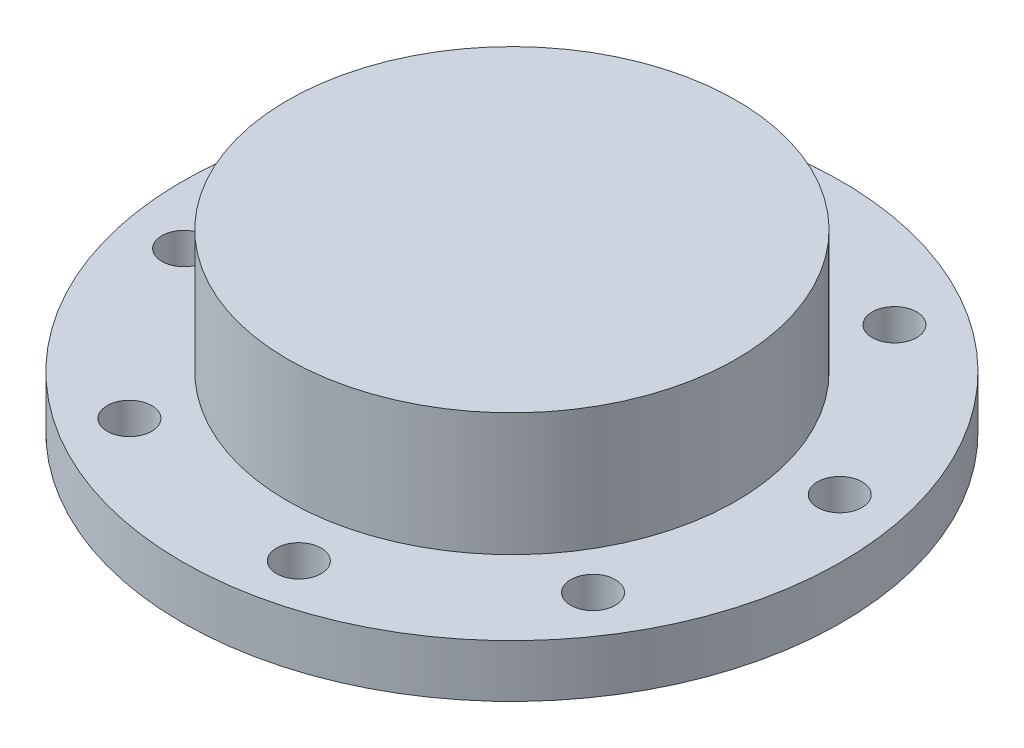
ISO-10303-21;
HEADER;
FILE_DESCRIPTION(('STEP AP214'),'2;1');
FILE_NAME('part.step','',(''),(''),'','','');
FILE_SCHEMA(('AUTOMOTIVE_DESIGN { 1 0 10303 214 1 1 1 1 }'));
ENDSEC;
DATA;
#1=APPLICATION_CONTEXT('core data for automotive mechanical design processes');
#2=APPLICATION_PROTOCOL_DEFINITION('international standard','automotive_design',2000,#1);
#3=PRODUCT_CONTEXT('',#1,'mechanical');
#4=PRODUCT('Part','Part','',(#3));
#5=PRODUCT_RELATED_PRODUCT_CATEGORY('part','',(#4));
#6=PRODUCT_DEFINITION_FORMATION('','',#4);
#7=PRODUCT_DEFINITION_CONTEXT('part definition',#1,'design');
#8=PRODUCT_DEFINITION('design','',#6,#7);
#9=PRODUCT_DEFINITION_SHAPE('','',#8);
#10=(LENGTH_UNIT() NAMED_UNIT(*) SI_UNIT(.MILLI.,.METRE.));
#11=(NAMED_UNIT(*) PLANE_ANGLE_UNIT() SI_UNIT($,.RADIAN.));
#12=(NAMED_UNIT(*) SI_UNIT($,.STERADIAN.) SOLID_ANGLE_UNIT());
#13=UNCERTAINTY_MEASURE_WITH_UNIT(LENGTH_MEASURE(1.E-05),#10,'distance_accuracy_value','');
#14=(GEOMETRIC_REPRESENTATION_CONTEXT(3) GLOBAL_UNCERTAINTY_ASSIGNED_CONTEXT((#13)) GLOBAL_UNIT_ASSIGNED_CONTEXT((#10,
#11,#12)) REPRESENTATION_CONTEXT('',''));
#15=CARTESIAN_POINT('',(0.,0.,0.));
#16=DIRECTION('',(0.,0.,1.));
#17=DIRECTION('',(1.,0.,0.));
#18=AXIS2_PLACEMENT_3D('',#15,#16,#17);
#19=CARTESIAN_POINT('',(0.,-212.944683547694,0.));
#20=DIRECTION('',(0.,1.,0.));
#21=DIRECTION('',(0.,0.,1.));
#22=AXIS2_PLACEMENT_3D('',#19,#20,#21);
#23=PLANE('',#22);
#24=CARTESIAN_POINT('',(-0.00553212594952037,-212.944683547694,0.));
#25=DIRECTION('',(0.,1.,0.));
#26=DIRECTION('',(0.,0.,1.));
#27=AXIS2_PLACEMENT_3D('',#24,#25,#26);
#28=CIRCLE('',#27,63.8870597874158);
#29=CARTESIAN_POINT('',(-0.00553212594952037,-212.944683547694,63.8870597874158));
#30=VERTEX_POINT('',#29);
#31=EDGE_CURVE('E40',#30,#30,#28,.T.);
#32=ORIENTED_EDGE('',*,*,#31,.T.);
#33=EDGE_LOOP('',(#32));
#34=FACE_BOUND('',#33,.T.);
#35=ADVANCED_FACE('F36',(#34),#23,.T.);
#36=CARTESIAN_POINT('',(-0.00553212594954357,165.815985113531,0.));
#37=DIRECTION('',(0.,1.,0.));
#38=DIRECTION('',(-1.,0.,0.));
#39=AXIS2_PLACEMENT_3D('',#36,#37,#38);
#40=CYLINDRICAL_SURFACE('',#39,63.8870597874158);
#41=CARTESIAN_POINT('',(-0.00553212594951823,-247.944683547694,0.));
#42=DIRECTION('',(0.,1.,0.));
#43=DIRECTION('',(0.,0.,1.));
#44=AXIS2_PLACEMENT_3D('',#41,#42,#43);
#45=CIRCLE('',#44,63.8870597874158);
#46=CARTESIAN_POINT('',(-0.00553212594951823,-247.944683547694,63.8870597874158));
#47=VERTEX_POINT('',#46);
#48=EDGE_CURVE('E10',#47,#47,#45,.T.);
#49=ORIENTED_EDGE('',*,*,#48,.T.);
#50=EDGE_LOOP('',(#49));
#51=FACE_BOUND('',#50,.T.);
#52=ORIENTED_EDGE('',*,*,#31,.F.);
#53=EDGE_LOOP('',(#52));
#54=FACE_BOUND('',#53,.T.);
#55=ADVANCED_FACE('F38',(#51,#54),#40,.T.);
#56=CARTESIAN_POINT('',(0.,-262.944683547694,0.));
#57=DIRECTION('',(0.,1.,0.));
#58=DIRECTION('',(0.,0.,1.));
#59=AXIS2_PLACEMENT_3D('',#56,#57,#58);
#60=PLANE('',#59);
#61=CARTESIAN_POINT('',(0.,-262.944683547694,0.));
#62=DIRECTION('',(0.,-1.,0.));
#63=DIRECTION('',(0.,0.,-1.));
#64=AXIS2_PLACEMENT_3D('',#61,#62,#63);
#65=CIRCLE('',#64,56.895);
#66=CARTESIAN_POINT('',(0.,-262.944683547694,-56.895));
#67=VERTEX_POINT('',#66);
#68=EDGE_CURVE('E120',#67,#67,#65,.T.);
#69=ORIENTED_EDGE('',*,*,#68,.F.);
#70=EDGE_LOOP('',(#69));
#71=FACE_BOUND('',#70,.T.);
#72=CARTESIAN_POINT('',(-77.0486836093335,-262.944683547694,16.3377712930384));
#73=DIRECTION('',(0.,-1.,0.));
#74=DIRECTION('',(0.,0.,-1.));
#75=AXIS2_PLACEMENT_3D('',#72,#73,#74);
#76=CIRCLE('',#75,6.34999999999999);
#77=CARTESIAN_POINT('',(-77.0486836093335,-262.944683547694,9.98777129303844));
#78=VERTEX_POINT('',#77);
#79=EDGE_CURVE('E116',#78,#78,#76,.T.);
#80=ORIENTED_EDGE('',*,*,#79,.F.);
#81=EDGE_LOOP('',(#80));
#82=FACE_BOUND('',#81,.T.);
#83=CARTESIAN_POINT('',(-16.3377712930382,-262.944683547694,-77.0486836093336));
#84=DIRECTION('',(0.,-1.,0.));
#85=DIRECTION('',(0.,0.,-1.));
#86=AXIS2_PLACEMENT_3D('',#83,#84,#85);
#87=CIRCLE('',#86,6.35);
#88=CARTESIAN_POINT('',(-16.3377712930382,-262.944683547694,-83.3986836093336));
#89=VERTEX_POINT('',#88);
#90=EDGE_CURVE('E100',#89,#89,#87,.T.);
#91=ORIENTED_EDGE('',*,*,#90,.F.);
#92=EDGE_LOOP('',(#91));
#93=FACE_BOUND('',#92,.T.);
#94=CARTESIAN_POINT('',(77.0486836093336,-262.944683547694,-16.3377712930379));
#95=DIRECTION('',(0.,-1.,0.));
#96=DIRECTION('',(0.,0.,-1.));
#97=AXIS2_PLACEMENT_3D('',#94,#95,#96);
#98=CIRCLE('',#97,6.34999999999999);
#99=CARTESIAN_POINT('',(77.0486836093336,-262.944683547694,-22.6877712930379));
#100=VERTEX_POINT('',#99);
#101=EDGE_CURVE('E84',#100,#100,#98,.T.);
#102=ORIENTED_EDGE('',*,*,#101,.F.);
#103=EDGE_LOOP('',(#102));
#104=FACE_BOUND('',#103,.T.);
#105=CARTESIAN_POINT('',(16.3377712930376,-262.944683547694,77.0486836093337));
#106=DIRECTION('',(0.,-1.,0.));
#107=DIRECTION('',(0.,0.,-1.));
#108=AXIS2_PLACEMENT_3D('',#105,#106,#107);
#109=CIRCLE('',#108,6.35);
#110=CARTESIAN_POINT('',(16.3377712930376,-262.944683547694,70.6986836093337));
#111=VERTEX_POINT('',#110);
#112=EDGE_CURVE('E68',#111,#111,#109,.T.);
#113=ORIENTED_EDGE('',*,*,#112,.F.);
#114=EDGE_LOOP('',(#113));
#115=FACE_BOUND('',#114,.T.);
#116=CARTESIAN_POINT('',(-42.9290977908749,-262.944683547694,66.0341955324384));
#117=DIRECTION('',(0.,-1.,0.));
#118=DIRECTION('',(0.,0.,-1.));
#119=AXIS2_PLACEMENT_3D('',#116,#117,#118);
#120=CIRCLE('',#119,6.35);
#121=CARTESIAN_POINT('',(-42.9290977908749,-262.944683547694,59.6841955324384));
#122=VERTEX_POINT('',#121);
#123=EDGE_CURVE('E60',#122,#122,#120,.T.);
#124=ORIENTED_EDGE('',*,*,#123,.F.);
#125=EDGE_LOOP('',(#124));
#126=FACE_BOUND('',#125,.T.);
#127=CARTESIAN_POINT('',(0.,-262.944683547694,0.));
#128=DIRECTION('',(0.,1.,0.));
#129=DIRECTION('',(0.,0.,1.));
#130=AXIS2_PLACEMENT_3D('',#127,#128,#129);
#131=CIRCLE('',#130,93.8815276614418);
#132=CARTESIAN_POINT('',(0.,-262.944683547694,93.8815276614418));
#133=VERTEX_POINT('',#132);
#134=EDGE_CURVE('E50',#133,#133,#131,.T.);
#135=ORIENTED_EDGE('',*,*,#134,.F.);
#136=EDGE_LOOP('',(#135));
#137=FACE_BOUND('',#136,.T.);
#138=CARTESIAN_POINT('',(66.0341955324385,-262.944683547694,42.9290977908747));
#139=DIRECTION('',(0.,-1.,0.));
#140=DIRECTION('',(0.,0.,-1.));
#141=AXIS2_PLACEMENT_3D('',#138,#139,#140);
#142=CIRCLE('',#141,6.34999999999999);
#143=CARTESIAN_POINT('',(66.0341955324385,-262.944683547694,36.5790977908747));
#144=VERTEX_POINT('',#143);
#145=EDGE_CURVE('E76',#144,#144,#142,.T.);
#146=ORIENTED_EDGE('',*,*,#145,.F.);
#147=EDGE_LOOP('',(#146));
#148=FACE_BOUND('',#147,.T.);
#149=CARTESIAN_POINT('',(42.9290977908749,-262.944683547694,-66.0341955324384));
#150=DIRECTION('',(0.,-1.,0.));
#151=DIRECTION('',(0.,0.,-1.));
#152=AXIS2_PLACEMENT_3D('',#149,#150,#151);
#153=CIRCLE('',#152,6.35);
#154=CARTESIAN_POINT('',(42.9290977908749,-262.944683547694,-72.3841955324384));
#155=VERTEX_POINT('',#154);
#156=EDGE_CURVE('E92',#155,#155,#153,.T.);
#157=ORIENTED_EDGE('',*,*,#156,.F.);
#158=EDGE_LOOP('',(#157));
#159=FACE_BOUND('',#158,.T.);
#160=CARTESIAN_POINT('',(-66.0341955324388,-262.944683547694,-42.9290977908743));
#161=DIRECTION('',(0.,-1.,0.));
#162=DIRECTION('',(0.,0.,-1.));
#163=AXIS2_PLACEMENT_3D('',#160,#161,#162);
#164=CIRCLE('',#163,6.35);
#165=CARTESIAN_POINT('',(-66.0341955324388,-262.944683547694,-49.2790977908743));
#166=VERTEX_POINT('',#165);
#167=EDGE_CURVE('E108',#166,#166,#164,.T.);
#168=ORIENTED_EDGE('',*,*,#167,.F.);
#169=EDGE_LOOP('',(#168));
#170=FACE_BOUND('',#169,.T.);
#171=ADVANCED_FACE('F153',(#71,#82,#93,#104,#115,#126,#137,#148,#159,#170),#60,.F.);
#172=CARTESIAN_POINT('',(0.,-247.944683547694,0.));
#173=DIRECTION('',(0.,1.,0.));
#174=DIRECTION('',(0.,0.,1.));
#175=AXIS2_PLACEMENT_3D('',#172,#173,#174);
#176=PLANE('',#175);
#177=CARTESIAN_POINT('',(-77.0486836093335,-247.944683547694,16.3377712930384));
#178=DIRECTION('',(0.,1.,0.));
#179=DIRECTION('',(0.,0.,1.));
#180=AXIS2_PLACEMENT_3D('',#177,#178,#179);
#181=CIRCLE('',#180,6.34999999999998);
#182=CARTESIAN_POINT('',(-77.0486836093335,-247.944683547694,22.6877712930384));
#183=VERTEX_POINT('',#182);
#184=EDGE_CURVE('E112',#183,#183,#181,.T.);
#185=ORIENTED_EDGE('',*,*,#184,.F.);
#186=EDGE_LOOP('',(#185));
#187=FACE_BOUND('',#186,.T.);
#188=CARTESIAN_POINT('',(-66.0341955324388,-247.944683547694,-42.9290977908743));
#189=DIRECTION('',(0.,1.,0.));
#190=DIRECTION('',(0.,0.,1.));
#191=AXIS2_PLACEMENT_3D('',#188,#189,#190);
#192=CIRCLE('',#191,6.34999999999999);
#193=CARTESIAN_POINT('',(-66.0341955324388,-247.944683547694,-36.5790977908743));
#194=VERTEX_POINT('',#193);
#195=EDGE_CURVE('E104',#194,#194,#192,.T.);
#196=ORIENTED_EDGE('',*,*,#195,.F.);
#197=EDGE_LOOP('',(#196));
#198=FACE_BOUND('',#197,.T.);
#199=CARTESIAN_POINT('',(-16.3377712930382,-247.944683547694,-77.0486836093336));
#200=DIRECTION('',(0.,1.,0.));
#201=DIRECTION('',(0.,0.,1.));
#202=AXIS2_PLACEMENT_3D('',#199,#200,#201);
#203=CIRCLE('',#202,6.34999999999999);
#204=CARTESIAN_POINT('',(-16.3377712930382,-247.944683547694,-70.6986836093336));
#205=VERTEX_POINT('',#204);
#206=EDGE_CURVE('E96',#205,#205,#203,.T.);
#207=ORIENTED_EDGE('',*,*,#206,.F.);
#208=EDGE_LOOP('',(#207));
#209=FACE_BOUND('',#208,.T.);
#210=CARTESIAN_POINT('',(42.9290977908749,-247.944683547694,-66.0341955324384));
#211=DIRECTION('',(0.,1.,0.));
#212=DIRECTION('',(0.,0.,1.));
#213=AXIS2_PLACEMENT_3D('',#210,#211,#212);
#214=CIRCLE('',#213,6.34999999999999);
#215=CARTESIAN_POINT('',(42.9290977908749,-247.944683547694,-59.6841955324384));
#216=VERTEX_POINT('',#215);
#217=EDGE_CURVE('E88',#216,#216,#214,.T.);
#218=ORIENTED_EDGE('',*,*,#217,.F.);
#219=EDGE_LOOP('',(#218));
#220=FACE_BOUND('',#219,.T.);
#221=CARTESIAN_POINT('',(77.0486836093336,-247.944683547694,-16.3377712930379));
#222=DIRECTION('',(0.,1.,0.));
#223=DIRECTION('',(0.,0.,1.));
#224=AXIS2_PLACEMENT_3D('',#221,#222,#223);
#225=CIRCLE('',#224,6.34999999999998);
#226=CARTESIAN_POINT('',(77.0486836093336,-247.944683547694,-9.98777129303792));
#227=VERTEX_POINT('',#226);
#228=EDGE_CURVE('E80',#227,#227,#225,.T.);
#229=ORIENTED_EDGE('',*,*,#228,.F.);
#230=EDGE_LOOP('',(#229));
#231=FACE_BOUND('',#230,.T.);
#232=CARTESIAN_POINT('',(66.0341955324385,-247.944683547694,42.9290977908747));
#233=DIRECTION('',(0.,1.,0.));
#234=DIRECTION('',(0.,0.,1.));
#235=AXIS2_PLACEMENT_3D('',#232,#233,#234);
#236=CIRCLE('',#235,6.34999999999998);
#237=CARTESIAN_POINT('',(66.0341955324385,-247.944683547694,49.2790977908747));
#238=VERTEX_POINT('',#237);
#239=EDGE_CURVE('E72',#238,#238,#236,.T.);
#240=ORIENTED_EDGE('',*,*,#239,.F.);
#241=EDGE_LOOP('',(#240));
#242=FACE_BOUND('',#241,.T.);
#243=CARTESIAN_POINT('',(16.3377712930376,-247.944683547694,77.0486836093337));
#244=DIRECTION('',(0.,1.,0.));
#245=DIRECTION('',(0.,0.,1.));
#246=AXIS2_PLACEMENT_3D('',#243,#244,#245);
#247=CIRCLE('',#246,6.34999999999999);
#248=CARTESIAN_POINT('',(16.3377712930376,-247.944683547694,83.3986836093337));
#249=VERTEX_POINT('',#248);
#250=EDGE_CURVE('E64',#249,#249,#247,.T.);
#251=ORIENTED_EDGE('',*,*,#250,.F.);
#252=EDGE_LOOP('',(#251));
#253=FACE_BOUND('',#252,.T.);
#254=CARTESIAN_POINT('',(-42.9290977908749,-247.944683547694,66.0341955324384));
#255=DIRECTION('',(0.,1.,0.));
#256=DIRECTION('',(0.,0.,1.));
#257=AXIS2_PLACEMENT_3D('',#254,#255,#256);
#258=CIRCLE('',#257,6.34999999999999);
#259=CARTESIAN_POINT('',(-42.9290977908749,-247.944683547694,72.3841955324384));
#260=VERTEX_POINT('',#259);
#261=EDGE_CURVE('E55',#260,#260,#258,.T.);
#262=ORIENTED_EDGE('',*,*,#261,.F.);
#263=EDGE_LOOP('',(#262));
#264=FACE_BOUND('',#263,.T.);
#265=ORIENTED_EDGE('',*,*,#48,.F.);
#266=EDGE_LOOP('',(#265));
#267=FACE_BOUND('',#266,.T.);
#268=CARTESIAN_POINT('',(0.,-247.944683547694,0.));
#269=DIRECTION('',(0.,1.,0.));
#270=DIRECTION('',(0.,0.,1.));
#271=AXIS2_PLACEMENT_3D('',#268,#269,#270);
#272=CIRCLE('',#271,93.8815276614418);
#273=CARTESIAN_POINT('',(0.,-247.944683547694,93.8815276614418));
#274=VERTEX_POINT('',#273);
#275=EDGE_CURVE('E45',#274,#274,#272,.T.);
#276=ORIENTED_EDGE('',*,*,#275,.T.);
#277=EDGE_LOOP('',(#276));
#278=FACE_BOUND('',#277,.T.);
#279=ADVANCED_FACE('F156',(#187,#198,#209,#220,#231,#242,#253,#264,#267,#278),#176,.T.);
#280=CARTESIAN_POINT('',(0.,-247.944683547694,0.));
#281=DIRECTION('',(0.,-1.,0.));
#282=DIRECTION('',(0.,0.,-1.));
#283=AXIS2_PLACEMENT_3D('',#280,#281,#282);
#284=CYLINDRICAL_SURFACE('',#283,93.8815276614418);
#285=ORIENTED_EDGE('',*,*,#275,.F.);
#286=EDGE_LOOP('',(#285));
#287=FACE_BOUND('',#286,.T.);
#288=ORIENTED_EDGE('',*,*,#134,.T.);
#289=EDGE_LOOP('',(#288));
#290=FACE_BOUND('',#289,.T.);
#291=ADVANCED_FACE('F207',(#287,#290),#284,.T.);
#292=CARTESIAN_POINT('',(-42.9290977908749,-262.944683547694,66.0341955324384));
#293=DIRECTION('',(0.,-1.,0.));
#294=DIRECTION('',(0.,0.,-1.));
#295=AXIS2_PLACEMENT_3D('',#292,#293,#294);
#296=CYLINDRICAL_SURFACE('',#295,6.34999999999999);
#297=ORIENTED_EDGE('',*,*,#261,.T.);
#298=EDGE_LOOP('',(#297));
#299=FACE_BOUND('',#298,.T.);
#300=ORIENTED_EDGE('',*,*,#123,.T.);
#301=EDGE_LOOP('',(#300));
#302=FACE_BOUND('',#301,.T.);
#303=ADVANCED_FACE('F212',(#299,#302),#296,.F.);
#304=CARTESIAN_POINT('',(16.3377712930376,-262.944683547694,77.0486836093337));
#305=DIRECTION('',(0.,-1.,0.));
#306=DIRECTION('',(0.,0.,-1.));
#307=AXIS2_PLACEMENT_3D('',#304,#305,#306);
#308=CYLINDRICAL_SURFACE('',#307,6.34999999999999);
#309=ORIENTED_EDGE('',*,*,#250,.T.);
#310=EDGE_LOOP('',(#309));
#311=FACE_BOUND('',#310,.T.);
#312=ORIENTED_EDGE('',*,*,#112,.T.);
#313=EDGE_LOOP('',(#312));
#314=FACE_BOUND('',#313,.T.);
#315=ADVANCED_FACE('F208',(#311,#314),#308,.F.);
#316=CARTESIAN_POINT('',(66.0341955324385,-262.944683547694,42.9290977908747));
#317=DIRECTION('',(0.,-1.,0.));
#318=DIRECTION('',(0.,0.,-1.));
#319=AXIS2_PLACEMENT_3D('',#316,#317,#318);
#320=CYLINDRICAL_SURFACE('',#319,6.34999999999998);
#321=ORIENTED_EDGE('',*,*,#239,.T.);
#322=EDGE_LOOP('',(#321));
#323=FACE_BOUND('',#322,.T.);
#324=ORIENTED_EDGE('',*,*,#145,.T.);
#325=EDGE_LOOP('',(#324));
#326=FACE_BOUND('',#325,.T.);
#327=ADVANCED_FACE('F211',(#323,#326),#320,.F.);
#328=CARTESIAN_POINT('',(77.0486836093336,-262.944683547694,-16.3377712930379));
#329=DIRECTION('',(0.,-1.,0.));
#330=DIRECTION('',(0.,0.,-1.));
#331=AXIS2_PLACEMENT_3D('',#328,#329,#330);
#332=CYLINDRICAL_SURFACE('',#331,6.34999999999998);
#333=ORIENTED_EDGE('',*,*,#228,.T.);
#334=EDGE_LOOP('',(#333));
#335=FACE_BOUND('',#334,.T.);
#336=ORIENTED_EDGE('',*,*,#101,.T.);
#337=EDGE_LOOP('',(#336));
#338=FACE_BOUND('',#337,.T.);
#339=ADVANCED_FACE('F214',(#335,#338),#332,.F.);
#340=CARTESIAN_POINT('',(42.9290977908749,-262.944683547694,-66.0341955324384));
#341=DIRECTION('',(0.,-1.,0.));
#342=DIRECTION('',(0.,0.,-1.));
#343=AXIS2_PLACEMENT_3D('',#340,#341,#342);
#344=CYLINDRICAL_SURFACE('',#343,6.34999999999999);
#345=ORIENTED_EDGE('',*,*,#217,.T.);
#346=EDGE_LOOP('',(#345));
#347=FACE_BOUND('',#346,.T.);
#348=ORIENTED_EDGE('',*,*,#156,.T.);
#349=EDGE_LOOP('',(#348));
#350=FACE_BOUND('',#349,.T.);
#351=ADVANCED_FACE('F188',(#347,#350),#344,.F.);
#352=CARTESIAN_POINT('',(-16.3377712930382,-262.944683547694,-77.0486836093336));
#353=DIRECTION('',(0.,-1.,0.));
#354=DIRECTION('',(0.,0.,-1.));
#355=AXIS2_PLACEMENT_3D('',#352,#353,#354);
#356=CYLINDRICAL_SURFACE('',#355,6.34999999999999);
#357=ORIENTED_EDGE('',*,*,#206,.T.);
#358=EDGE_LOOP('',(#357));
#359=FACE_BOUND('',#358,.T.);
#360=ORIENTED_EDGE('',*,*,#90,.T.);
#361=EDGE_LOOP('',(#360));
#362=FACE_BOUND('',#361,.T.);
#363=ADVANCED_FACE('F179',(#359,#362),#356,.F.);
#364=CARTESIAN_POINT('',(-66.0341955324388,-262.944683547694,-42.9290977908743));
#365=DIRECTION('',(0.,-1.,0.));
#366=DIRECTION('',(0.,0.,-1.));
#367=AXIS2_PLACEMENT_3D('',#364,#365,#366);
#368=CYLINDRICAL_SURFACE('',#367,6.34999999999999);
#369=ORIENTED_EDGE('',*,*,#195,.T.);
#370=EDGE_LOOP('',(#369));
#371=FACE_BOUND('',#370,.T.);
#372=ORIENTED_EDGE('',*,*,#167,.T.);
#373=EDGE_LOOP('',(#372));
#374=FACE_BOUND('',#373,.T.);
#375=ADVANCED_FACE('F177',(#371,#374),#368,.F.);
#376=CARTESIAN_POINT('',(-77.0486836093335,-262.944683547694,16.3377712930384));
#377=DIRECTION('',(0.,-1.,0.));
#378=DIRECTION('',(0.,0.,-1.));
#379=AXIS2_PLACEMENT_3D('',#376,#377,#378);
#380=CYLINDRICAL_SURFACE('',#379,6.34999999999998);
#381=ORIENTED_EDGE('',*,*,#184,.T.);
#382=EDGE_LOOP('',(#381));
#383=FACE_BOUND('',#382,.T.);
#384=ORIENTED_EDGE('',*,*,#79,.T.);
#385=EDGE_LOOP('',(#384));
#386=FACE_BOUND('',#385,.T.);
#387=ADVANCED_FACE('F149',(#383,#386),#380,.F.);
#388=CARTESIAN_POINT('',(0.,-256.944683547694,0.));
#389=DIRECTION('',(0.,-1.,0.));
#390=DIRECTION('',(0.,0.,-1.));
#391=AXIS2_PLACEMENT_3D('',#388,#389,#390);
#392=CYLINDRICAL_SURFACE('',#391,56.895);
#393=CARTESIAN_POINT('',(0.,-256.944683547694,0.));
#394=DIRECTION('',(0.,-1.,0.));
#395=DIRECTION('',(0.,0.,-1.));
#396=AXIS2_PLACEMENT_3D('',#393,#394,#395);
#397=CIRCLE('',#396,56.895);
#398=CARTESIAN_POINT('',(0.,-256.944683547694,-56.895));
#399=VERTEX_POINT('',#398);
#400=EDGE_CURVE('E124',#399,#399,#397,.T.);
#401=ORIENTED_EDGE('',*,*,#400,.F.);
#402=EDGE_LOOP('',(#401));
#403=FACE_BOUND('',#402,.T.);
#404=ORIENTED_EDGE('',*,*,#68,.T.);
#405=EDGE_LOOP('',(#404));
#406=FACE_BOUND('',#405,.T.);
#407=ADVANCED_FACE('F143',(#403,#406),#392,.F.);
#408=CARTESIAN_POINT('',(0.,-256.944683547694,0.));
#409=DIRECTION('',(0.,-1.,0.));
#410=DIRECTION('',(0.,0.,-1.));
#411=AXIS2_PLACEMENT_3D('',#408,#409,#410);
#412=PLANE('',#411);
#413=CARTESIAN_POINT('',(0.,-256.944683547694,0.));
#414=DIRECTION('',(0.,-1.,0.));
#415=DIRECTION('',(0.,0.,-1.));
#416=AXIS2_PLACEMENT_3D('',#413,#414,#415);
#417=CIRCLE('',#416,53.895);
#418=CARTESIAN_POINT('',(0.,-256.944683547694,-53.895));
#419=VERTEX_POINT('',#418);
#420=EDGE_CURVE('E125',#419,#419,#417,.T.);
#421=ORIENTED_EDGE('',*,*,#420,.F.);
#422=EDGE_LOOP('',(#421));
#423=FACE_BOUND('',#422,.T.);
#424=ORIENTED_EDGE('',*,*,#400,.T.);
#425=EDGE_LOOP('',(#424));
#426=FACE_BOUND('',#425,.T.);
#427=ADVANCED_FACE('F140',(#423,#426),#412,.T.);
#428=CARTESIAN_POINT('',(0.,-256.944683547694,0.));
#429=DIRECTION('',(0.,-1.,0.));
#430=DIRECTION('',(0.,0.,-1.));
#431=AXIS2_PLACEMENT_3D('',#428,#429,#430);
#432=CYLINDRICAL_SURFACE('',#431,53.895);
#433=ORIENTED_EDGE('',*,*,#420,.T.);
#434=EDGE_LOOP('',(#433));
#435=FACE_BOUND('',#434,.T.);
#436=CARTESIAN_POINT('',(0.,-262.944683547694,0.));
#437=DIRECTION('',(0.,-1.,0.));
#438=DIRECTION('',(0.,0.,-1.));
#439=AXIS2_PLACEMENT_3D('',#436,#437,#438);
#440=CIRCLE('',#439,53.895);
#441=CARTESIAN_POINT('',(0.,-262.944683547694,-53.895));
#442=VERTEX_POINT('',#441);
#443=EDGE_CURVE('E129',#442,#442,#440,.T.);
#444=ORIENTED_EDGE('',*,*,#443,.F.);
#445=EDGE_LOOP('',(#444));
#446=FACE_BOUND('',#445,.T.);
#447=ADVANCED_FACE('F137',(#435,#446),#432,.T.);
#448=ORIENTED_EDGE('',*,*,#443,.T.);
#449=EDGE_LOOP('',(#448));
#450=FACE_BOUND('',#449,.T.);
#451=ADVANCED_FACE('F158',(#450),#60,.F.);
#452=CLOSED_SHELL('',(#35,#55,#171,#279,#291,#303,#315,#327,#339,#351,#363,#375,#387,#407,#427,
#447,#451));
#453=MANIFOLD_SOLID_BREP('B2',#452);
#454=ADVANCED_BREP_SHAPE_REPRESENTATION('',(#18,#453),#14);
#455=SHAPE_DEFINITION_REPRESENTATION(#9,#454);
ENDSEC;
END-ISO-10303-21;
